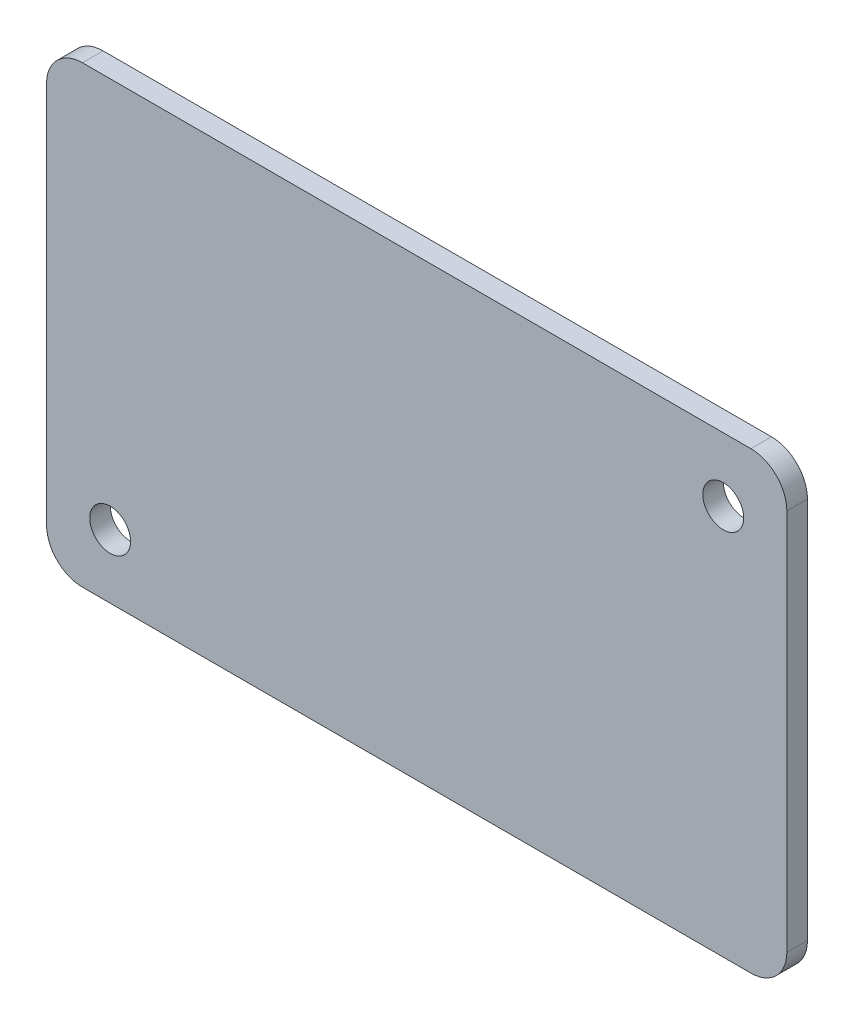
ISO-10303-21;
HEADER;
FILE_DESCRIPTION(('STEP AP214'),'2;1');
FILE_NAME('part.step','',(''),(''),'','','');
FILE_SCHEMA(('AUTOMOTIVE_DESIGN { 1 0 10303 214 1 1 1 1 }'));
ENDSEC;
DATA;
#1=APPLICATION_CONTEXT('core data for automotive mechanical design processes');
#2=APPLICATION_PROTOCOL_DEFINITION('international standard','automotive_design',2000,#1);
#3=PRODUCT_CONTEXT('',#1,'mechanical');
#4=PRODUCT('Part','Part','',(#3));
#5=PRODUCT_RELATED_PRODUCT_CATEGORY('part','',(#4));
#6=PRODUCT_DEFINITION_FORMATION('','',#4);
#7=PRODUCT_DEFINITION_CONTEXT('part definition',#1,'design');
#8=PRODUCT_DEFINITION('design','',#6,#7);
#9=PRODUCT_DEFINITION_SHAPE('','',#8);
#10=(LENGTH_UNIT() NAMED_UNIT(*) SI_UNIT(.MILLI.,.METRE.));
#11=(NAMED_UNIT(*) PLANE_ANGLE_UNIT() SI_UNIT($,.RADIAN.));
#12=(NAMED_UNIT(*) SI_UNIT($,.STERADIAN.) SOLID_ANGLE_UNIT());
#13=UNCERTAINTY_MEASURE_WITH_UNIT(LENGTH_MEASURE(1.E-05),#10,'distance_accuracy_value','');
#14=(GEOMETRIC_REPRESENTATION_CONTEXT(3) GLOBAL_UNCERTAINTY_ASSIGNED_CONTEXT((#13)) GLOBAL_UNIT_ASSIGNED_CONTEXT((#10,
#11,#12)) REPRESENTATION_CONTEXT('',''));
#15=CARTESIAN_POINT('',(0.,0.,0.));
#16=DIRECTION('',(0.,0.,1.));
#17=DIRECTION('',(1.,0.,0.));
#18=AXIS2_PLACEMENT_3D('',#15,#16,#17);
#19=CARTESIAN_POINT('',(0.,0.,1.6002));
#20=DIRECTION('',(0.,0.,-1.));
#21=DIRECTION('',(-1.,0.,0.));
#22=AXIS2_PLACEMENT_3D('',#19,#20,#21);
#23=PLANE('',#22);
#24=DIRECTION('',(-1.,0.,0.));
#25=VECTOR('',#24,1.);
#26=CARTESIAN_POINT('',(28.7528,17.6403,1.6002));
#27=LINE('',#26,#25);
#28=CARTESIAN_POINT('',(25.9588,17.6403,1.6002));
#29=VERTEX_POINT('',#28);
#30=CARTESIAN_POINT('',(-25.9588,17.6403,1.6002));
#31=VERTEX_POINT('',#30);
#32=EDGE_CURVE('E136',#29,#31,#27,.T.);
#33=ORIENTED_EDGE('',*,*,#32,.T.);
#34=CARTESIAN_POINT('',(-25.9588,14.8463,1.6002));
#35=DIRECTION('',(0.,0.,-1.));
#36=DIRECTION('',(-1.,0.,0.));
#37=AXIS2_PLACEMENT_3D('',#34,#35,#36);
#38=CIRCLE('',#37,2.794);
#39=CARTESIAN_POINT('',(-28.7528,14.8463,1.6002));
#40=VERTEX_POINT('',#39);
#41=EDGE_CURVE('E155',#31,#40,#38,.F.);
#42=ORIENTED_EDGE('',*,*,#41,.T.);
#43=DIRECTION('',(0.,-1.,0.));
#44=VECTOR('',#43,1.);
#45=CARTESIAN_POINT('',(-28.7528,17.6403,1.6002));
#46=LINE('',#45,#44);
#47=CARTESIAN_POINT('',(-28.7528,-14.8463,1.6002));
#48=VERTEX_POINT('',#47);
#49=EDGE_CURVE('E119',#40,#48,#46,.T.);
#50=ORIENTED_EDGE('',*,*,#49,.T.);
#51=CARTESIAN_POINT('',(-25.9588,-14.8463,1.6002));
#52=DIRECTION('',(0.,0.,-1.));
#53=DIRECTION('',(-1.,0.,0.));
#54=AXIS2_PLACEMENT_3D('',#51,#52,#53);
#55=CIRCLE('',#54,2.794);
#56=CARTESIAN_POINT('',(-25.9588,-17.6403,1.6002));
#57=VERTEX_POINT('',#56);
#58=EDGE_CURVE('E153',#48,#57,#55,.F.);
#59=ORIENTED_EDGE('',*,*,#58,.T.);
#60=DIRECTION('',(1.,0.,0.));
#61=VECTOR('',#60,1.);
#62=CARTESIAN_POINT('',(28.7528,-17.6403,1.6002));
#63=LINE('',#62,#61);
#64=CARTESIAN_POINT('',(25.9588,-17.6403,1.6002));
#65=VERTEX_POINT('',#64);
#66=EDGE_CURVE('E166',#57,#65,#63,.T.);
#67=ORIENTED_EDGE('',*,*,#66,.T.);
#68=CARTESIAN_POINT('',(25.9588,-14.8463,1.6002));
#69=DIRECTION('',(0.,0.,-1.));
#70=DIRECTION('',(-1.,0.,0.));
#71=AXIS2_PLACEMENT_3D('',#68,#69,#70);
#72=CIRCLE('',#71,2.794);
#73=CARTESIAN_POINT('',(28.7528,-14.8463,1.6002));
#74=VERTEX_POINT('',#73);
#75=EDGE_CURVE('E54',#65,#74,#72,.F.);
#76=ORIENTED_EDGE('',*,*,#75,.T.);
#77=DIRECTION('',(0.,1.,0.));
#78=VECTOR('',#77,1.);
#79=CARTESIAN_POINT('',(28.7528,17.6403,1.6002));
#80=LINE('',#79,#78);
#81=CARTESIAN_POINT('',(28.7528,14.8463,1.6002));
#82=VERTEX_POINT('',#81);
#83=EDGE_CURVE('E174',#74,#82,#80,.T.);
#84=ORIENTED_EDGE('',*,*,#83,.T.);
#85=CARTESIAN_POINT('',(25.9588,14.8463,1.6002));
#86=DIRECTION('',(0.,0.,-1.));
#87=DIRECTION('',(-1.,0.,0.));
#88=AXIS2_PLACEMENT_3D('',#85,#86,#87);
#89=CIRCLE('',#88,2.794);
#90=EDGE_CURVE('E150',#82,#29,#89,.F.);
#91=ORIENTED_EDGE('',*,*,#90,.T.);
#92=EDGE_LOOP('',(#33,#42,#50,#59,#67,#76,#84,#91));
#93=FACE_BOUND('',#92,.T.);
#94=CARTESIAN_POINT('',(-23.8125,-12.7,1.6002));
#95=DIRECTION('',(0.,0.,1.));
#96=DIRECTION('',(1.,0.,0.));
#97=AXIS2_PLACEMENT_3D('',#94,#95,#96);
#98=CIRCLE('',#97,1.5875);
#99=CARTESIAN_POINT('',(-22.225,-12.7,1.6002));
#100=VERTEX_POINT('',#99);
#101=EDGE_CURVE('E127',#100,#100,#98,.T.);
#102=ORIENTED_EDGE('',*,*,#101,.F.);
#103=EDGE_LOOP('',(#102));
#104=FACE_BOUND('',#103,.T.);
#105=CARTESIAN_POINT('',(23.8125,12.7,1.6002));
#106=DIRECTION('',(0.,0.,1.));
#107=DIRECTION('',(1.,0.,0.));
#108=AXIS2_PLACEMENT_3D('',#105,#106,#107);
#109=CIRCLE('',#108,1.5875);
#110=CARTESIAN_POINT('',(25.4,12.7,1.6002));
#111=VERTEX_POINT('',#110);
#112=EDGE_CURVE('E181',#111,#111,#109,.T.);
#113=ORIENTED_EDGE('',*,*,#112,.F.);
#114=EDGE_LOOP('',(#113));
#115=FACE_BOUND('',#114,.T.);
#116=ADVANCED_FACE('F33',(#93,#104,#115),#23,.F.);
#117=CARTESIAN_POINT('',(0.,0.,0.));
#118=DIRECTION('',(0.,0.,-1.));
#119=DIRECTION('',(-1.,0.,0.));
#120=AXIS2_PLACEMENT_3D('',#117,#118,#119);
#121=PLANE('',#120);
#122=CARTESIAN_POINT('',(-23.8125,-12.7,0.));
#123=DIRECTION('',(0.,0.,1.));
#124=DIRECTION('',(1.,0.,0.));
#125=AXIS2_PLACEMENT_3D('',#122,#123,#124);
#126=CIRCLE('',#125,1.5875);
#127=CARTESIAN_POINT('',(-22.225,-12.7,0.));
#128=VERTEX_POINT('',#127);
#129=EDGE_CURVE('E133',#128,#128,#126,.T.);
#130=ORIENTED_EDGE('',*,*,#129,.T.);
#131=EDGE_LOOP('',(#130));
#132=FACE_BOUND('',#131,.T.);
#133=DIRECTION('',(0.,-1.,0.));
#134=VECTOR('',#133,1.);
#135=CARTESIAN_POINT('',(-28.7528,17.6403,0.));
#136=LINE('',#135,#134);
#137=CARTESIAN_POINT('',(-28.7528,14.8463,0.));
#138=VERTEX_POINT('',#137);
#139=CARTESIAN_POINT('',(-28.7528,-14.8463,0.));
#140=VERTEX_POINT('',#139);
#141=EDGE_CURVE('E116',#138,#140,#136,.T.);
#142=ORIENTED_EDGE('',*,*,#141,.F.);
#143=CARTESIAN_POINT('',(-25.9588,14.8463,0.));
#144=DIRECTION('',(0.,0.,-1.));
#145=DIRECTION('',(-1.,0.,0.));
#146=AXIS2_PLACEMENT_3D('',#143,#144,#145);
#147=CIRCLE('',#146,2.794);
#148=CARTESIAN_POINT('',(-25.9588,17.6403,0.));
#149=VERTEX_POINT('',#148);
#150=EDGE_CURVE('E99',#138,#149,#147,.T.);
#151=ORIENTED_EDGE('',*,*,#150,.T.);
#152=DIRECTION('',(-1.,0.,0.));
#153=VECTOR('',#152,1.);
#154=CARTESIAN_POINT('',(28.7528,17.6403,0.));
#155=LINE('',#154,#153);
#156=CARTESIAN_POINT('',(25.9588,17.6403,0.));
#157=VERTEX_POINT('',#156);
#158=EDGE_CURVE('E140',#157,#149,#155,.T.);
#159=ORIENTED_EDGE('',*,*,#158,.F.);
#160=CARTESIAN_POINT('',(25.9588,14.8463,0.));
#161=DIRECTION('',(0.,0.,-1.));
#162=DIRECTION('',(-1.,0.,0.));
#163=AXIS2_PLACEMENT_3D('',#160,#161,#162);
#164=CIRCLE('',#163,2.794);
#165=CARTESIAN_POINT('',(28.7528,14.8463,0.));
#166=VERTEX_POINT('',#165);
#167=EDGE_CURVE('E120',#157,#166,#164,.T.);
#168=ORIENTED_EDGE('',*,*,#167,.T.);
#169=DIRECTION('',(0.,1.,0.));
#170=VECTOR('',#169,1.);
#171=CARTESIAN_POINT('',(28.7528,17.6403,0.));
#172=LINE('',#171,#170);
#173=CARTESIAN_POINT('',(28.7528,-14.8463,0.));
#174=VERTEX_POINT('',#173);
#175=EDGE_CURVE('E130',#174,#166,#172,.T.);
#176=ORIENTED_EDGE('',*,*,#175,.F.);
#177=CARTESIAN_POINT('',(25.9588,-14.8463,0.));
#178=DIRECTION('',(0.,0.,-1.));
#179=DIRECTION('',(-1.,0.,0.));
#180=AXIS2_PLACEMENT_3D('',#177,#178,#179);
#181=CIRCLE('',#180,2.794);
#182=CARTESIAN_POINT('',(25.9588,-17.6403,0.));
#183=VERTEX_POINT('',#182);
#184=EDGE_CURVE('E144',#174,#183,#181,.T.);
#185=ORIENTED_EDGE('',*,*,#184,.T.);
#186=DIRECTION('',(1.,0.,0.));
#187=VECTOR('',#186,1.);
#188=CARTESIAN_POINT('',(28.7528,-17.6403,0.));
#189=LINE('',#188,#187);
#190=CARTESIAN_POINT('',(-25.9588,-17.6403,0.));
#191=VERTEX_POINT('',#190);
#192=EDGE_CURVE('E126',#191,#183,#189,.T.);
#193=ORIENTED_EDGE('',*,*,#192,.F.);
#194=CARTESIAN_POINT('',(-25.9588,-14.8463,0.));
#195=DIRECTION('',(0.,0.,-1.));
#196=DIRECTION('',(-1.,0.,0.));
#197=AXIS2_PLACEMENT_3D('',#194,#195,#196);
#198=CIRCLE('',#197,2.794);
#199=EDGE_CURVE('E110',#191,#140,#198,.T.);
#200=ORIENTED_EDGE('',*,*,#199,.T.);
#201=EDGE_LOOP('',(#142,#151,#159,#168,#176,#185,#193,#200));
#202=FACE_BOUND('',#201,.T.);
#203=CARTESIAN_POINT('',(23.8125,12.7,0.));
#204=DIRECTION('',(0.,0.,1.));
#205=DIRECTION('',(1.,0.,0.));
#206=AXIS2_PLACEMENT_3D('',#203,#204,#205);
#207=CIRCLE('',#206,1.5875);
#208=CARTESIAN_POINT('',(25.4,12.7,0.));
#209=VERTEX_POINT('',#208);
#210=EDGE_CURVE('E183',#209,#209,#207,.T.);
#211=ORIENTED_EDGE('',*,*,#210,.T.);
#212=EDGE_LOOP('',(#211));
#213=FACE_BOUND('',#212,.T.);
#214=ADVANCED_FACE('F123',(#132,#202,#213),#121,.T.);
#215=CARTESIAN_POINT('',(-28.7528,17.6403,1.6002));
#216=DIRECTION('',(1.,0.,0.));
#217=DIRECTION('',(0.,0.,-1.));
#218=AXIS2_PLACEMENT_3D('',#215,#216,#217);
#219=PLANE('',#218);
#220=ORIENTED_EDGE('',*,*,#49,.F.);
#221=DIRECTION('',(0.,0.,-1.));
#222=VECTOR('',#221,1.);
#223=CARTESIAN_POINT('',(-28.7528,14.8463,1.6002));
#224=LINE('',#223,#222);
#225=EDGE_CURVE('E103',#40,#138,#224,.T.);
#226=ORIENTED_EDGE('',*,*,#225,.T.);
#227=ORIENTED_EDGE('',*,*,#141,.T.);
#228=DIRECTION('',(0.,0.,-1.));
#229=VECTOR('',#228,1.);
#230=CARTESIAN_POINT('',(-28.7528,-14.8463,1.6002));
#231=LINE('',#230,#229);
#232=EDGE_CURVE('E121',#140,#48,#231,.F.);
#233=ORIENTED_EDGE('',*,*,#232,.T.);
#234=EDGE_LOOP('',(#220,#226,#227,#233));
#235=FACE_BOUND('',#234,.T.);
#236=ADVANCED_FACE('F115',(#235),#219,.F.);
#237=CARTESIAN_POINT('',(28.7528,-17.6403,1.6002));
#238=DIRECTION('',(0.,1.,0.));
#239=DIRECTION('',(0.,0.,1.));
#240=AXIS2_PLACEMENT_3D('',#237,#238,#239);
#241=PLANE('',#240);
#242=ORIENTED_EDGE('',*,*,#66,.F.);
#243=DIRECTION('',(0.,0.,-1.));
#244=VECTOR('',#243,1.);
#245=CARTESIAN_POINT('',(-25.9588,-17.6403,1.6002));
#246=LINE('',#245,#244);
#247=EDGE_CURVE('E159',#57,#191,#246,.T.);
#248=ORIENTED_EDGE('',*,*,#247,.T.);
#249=ORIENTED_EDGE('',*,*,#192,.T.);
#250=DIRECTION('',(0.,0.,-1.));
#251=VECTOR('',#250,1.);
#252=CARTESIAN_POINT('',(25.9588,-17.6403,1.6002));
#253=LINE('',#252,#251);
#254=EDGE_CURVE('E157',#183,#65,#253,.F.);
#255=ORIENTED_EDGE('',*,*,#254,.T.);
#256=EDGE_LOOP('',(#242,#248,#249,#255));
#257=FACE_BOUND('',#256,.T.);
#258=ADVANCED_FACE('F164',(#257),#241,.F.);
#259=CARTESIAN_POINT('',(28.7528,17.6403,1.6002));
#260=DIRECTION('',(-1.,0.,0.));
#261=DIRECTION('',(0.,0.,1.));
#262=AXIS2_PLACEMENT_3D('',#259,#260,#261);
#263=PLANE('',#262);
#264=ORIENTED_EDGE('',*,*,#83,.F.);
#265=DIRECTION('',(0.,0.,-1.));
#266=VECTOR('',#265,1.);
#267=CARTESIAN_POINT('',(28.7528,-14.8463,1.6002));
#268=LINE('',#267,#266);
#269=EDGE_CURVE('E11',#74,#174,#268,.T.);
#270=ORIENTED_EDGE('',*,*,#269,.T.);
#271=ORIENTED_EDGE('',*,*,#175,.T.);
#272=DIRECTION('',(0.,0.,-1.));
#273=VECTOR('',#272,1.);
#274=CARTESIAN_POINT('',(28.7528,14.8463,1.6002));
#275=LINE('',#274,#273);
#276=EDGE_CURVE('E41',#166,#82,#275,.F.);
#277=ORIENTED_EDGE('',*,*,#276,.T.);
#278=EDGE_LOOP('',(#264,#270,#271,#277));
#279=FACE_BOUND('',#278,.T.);
#280=ADVANCED_FACE('F173',(#279),#263,.F.);
#281=CARTESIAN_POINT('',(28.7528,17.6403,1.6002));
#282=DIRECTION('',(0.,-1.,0.));
#283=DIRECTION('',(0.,0.,-1.));
#284=AXIS2_PLACEMENT_3D('',#281,#282,#283);
#285=PLANE('',#284);
#286=ORIENTED_EDGE('',*,*,#158,.T.);
#287=DIRECTION('',(0.,0.,-1.));
#288=VECTOR('',#287,1.);
#289=CARTESIAN_POINT('',(-25.9588,17.6403,1.6002));
#290=LINE('',#289,#288);
#291=EDGE_CURVE('E104',#149,#31,#290,.F.);
#292=ORIENTED_EDGE('',*,*,#291,.T.);
#293=ORIENTED_EDGE('',*,*,#32,.F.);
#294=DIRECTION('',(0.,0.,-1.));
#295=VECTOR('',#294,1.);
#296=CARTESIAN_POINT('',(25.9588,17.6403,1.6002));
#297=LINE('',#296,#295);
#298=EDGE_CURVE('E109',#29,#157,#297,.T.);
#299=ORIENTED_EDGE('',*,*,#298,.T.);
#300=EDGE_LOOP('',(#286,#292,#293,#299));
#301=FACE_BOUND('',#300,.T.);
#302=ADVANCED_FACE('F204',(#301),#285,.F.);
#303=CARTESIAN_POINT('',(-23.8125,-12.7,1.6002));
#304=DIRECTION('',(0.,0.,-1.));
#305=DIRECTION('',(-1.,0.,0.));
#306=AXIS2_PLACEMENT_3D('',#303,#304,#305);
#307=CYLINDRICAL_SURFACE('',#306,1.5875);
#308=ORIENTED_EDGE('',*,*,#101,.T.);
#309=EDGE_LOOP('',(#308));
#310=FACE_BOUND('',#309,.T.);
#311=ORIENTED_EDGE('',*,*,#129,.F.);
#312=EDGE_LOOP('',(#311));
#313=FACE_BOUND('',#312,.T.);
#314=ADVANCED_FACE('F201',(#310,#313),#307,.F.);
#315=CARTESIAN_POINT('',(23.8125,12.7,1.6002));
#316=DIRECTION('',(0.,0.,-1.));
#317=DIRECTION('',(-1.,0.,0.));
#318=AXIS2_PLACEMENT_3D('',#315,#316,#317);
#319=CYLINDRICAL_SURFACE('',#318,1.5875);
#320=ORIENTED_EDGE('',*,*,#112,.T.);
#321=EDGE_LOOP('',(#320));
#322=FACE_BOUND('',#321,.T.);
#323=ORIENTED_EDGE('',*,*,#210,.F.);
#324=EDGE_LOOP('',(#323));
#325=FACE_BOUND('',#324,.T.);
#326=ADVANCED_FACE('F189',(#322,#325),#319,.F.);
#327=CARTESIAN_POINT('',(-25.9588,14.8463,1.6002));
#328=DIRECTION('',(0.,0.,-1.));
#329=DIRECTION('',(-1.,0.,0.));
#330=AXIS2_PLACEMENT_3D('',#327,#328,#329);
#331=CYLINDRICAL_SURFACE('',#330,2.794);
#332=ORIENTED_EDGE('',*,*,#41,.F.);
#333=ORIENTED_EDGE('',*,*,#291,.F.);
#334=ORIENTED_EDGE('',*,*,#150,.F.);
#335=ORIENTED_EDGE('',*,*,#225,.F.);
#336=EDGE_LOOP('',(#332,#333,#334,#335));
#337=FACE_BOUND('',#336,.T.);
#338=ADVANCED_FACE('F102',(#337),#331,.T.);
#339=CARTESIAN_POINT('',(-25.9588,-14.8463,1.6002));
#340=DIRECTION('',(0.,0.,-1.));
#341=DIRECTION('',(-1.,0.,0.));
#342=AXIS2_PLACEMENT_3D('',#339,#340,#341);
#343=CYLINDRICAL_SURFACE('',#342,2.794);
#344=ORIENTED_EDGE('',*,*,#58,.F.);
#345=ORIENTED_EDGE('',*,*,#232,.F.);
#346=ORIENTED_EDGE('',*,*,#199,.F.);
#347=ORIENTED_EDGE('',*,*,#247,.F.);
#348=EDGE_LOOP('',(#344,#345,#346,#347));
#349=FACE_BOUND('',#348,.T.);
#350=ADVANCED_FACE('F216',(#349),#343,.T.);
#351=CARTESIAN_POINT('',(25.9588,-14.8463,1.6002));
#352=DIRECTION('',(0.,0.,-1.));
#353=DIRECTION('',(-1.,0.,0.));
#354=AXIS2_PLACEMENT_3D('',#351,#352,#353);
#355=CYLINDRICAL_SURFACE('',#354,2.794);
#356=ORIENTED_EDGE('',*,*,#75,.F.);
#357=ORIENTED_EDGE('',*,*,#254,.F.);
#358=ORIENTED_EDGE('',*,*,#184,.F.);
#359=ORIENTED_EDGE('',*,*,#269,.F.);
#360=EDGE_LOOP('',(#356,#357,#358,#359));
#361=FACE_BOUND('',#360,.T.);
#362=ADVANCED_FACE('F172',(#361),#355,.T.);
#363=CARTESIAN_POINT('',(25.9588,14.8463,1.6002));
#364=DIRECTION('',(0.,0.,-1.));
#365=DIRECTION('',(-1.,0.,0.));
#366=AXIS2_PLACEMENT_3D('',#363,#364,#365);
#367=CYLINDRICAL_SURFACE('',#366,2.794);
#368=ORIENTED_EDGE('',*,*,#90,.F.);
#369=ORIENTED_EDGE('',*,*,#276,.F.);
#370=ORIENTED_EDGE('',*,*,#167,.F.);
#371=ORIENTED_EDGE('',*,*,#298,.F.);
#372=EDGE_LOOP('',(#368,#369,#370,#371));
#373=FACE_BOUND('',#372,.T.);
#374=ADVANCED_FACE('F35',(#373),#367,.T.);
#375=CLOSED_SHELL('',(#116,#214,#236,#258,#280,#302,#314,#326,#338,#350,#362,#374));
#376=MANIFOLD_SOLID_BREP('B2',#375);
#377=ADVANCED_BREP_SHAPE_REPRESENTATION('',(#18,#376),#14);
#378=SHAPE_DEFINITION_REPRESENTATION(#9,#377);
ENDSEC;
END-ISO-10303-21;
